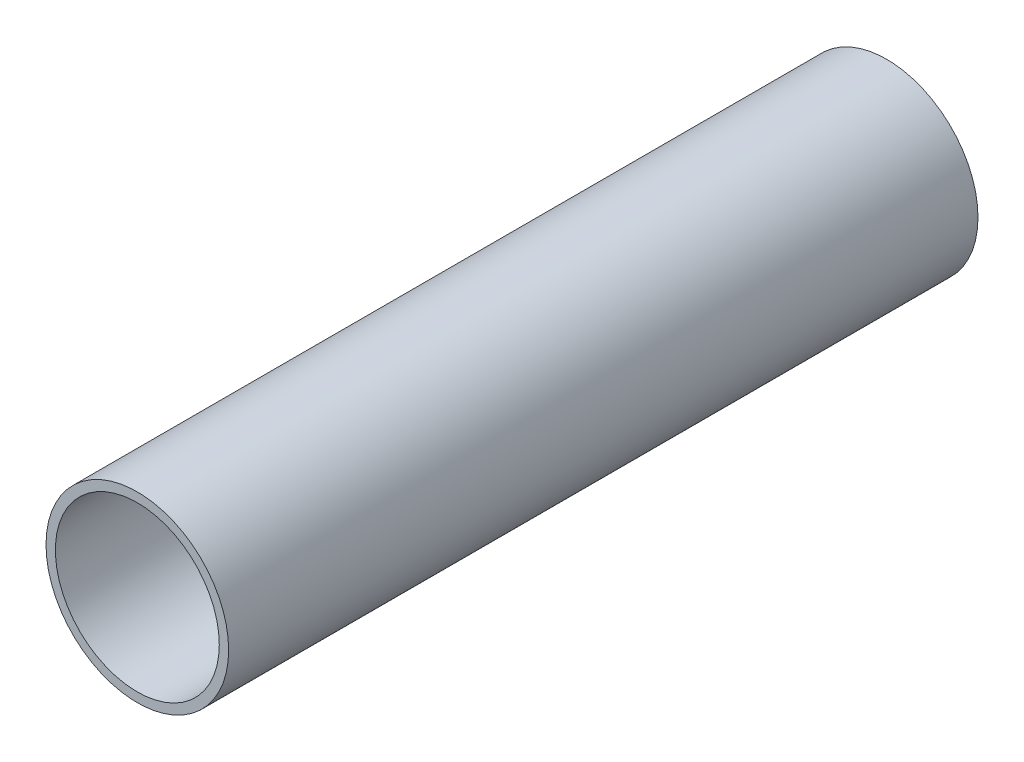
ISO-10303-21;
HEADER;
FILE_DESCRIPTION(('STEP AP214'),'2;1');
FILE_NAME('part.step','',(''),(''),'','','');
FILE_SCHEMA(('AUTOMOTIVE_DESIGN { 1 0 10303 214 1 1 1 1 }'));
ENDSEC;
DATA;
#1=APPLICATION_CONTEXT('core data for automotive mechanical design processes');
#2=APPLICATION_PROTOCOL_DEFINITION('international standard','automotive_design',2000,#1);
#3=PRODUCT_CONTEXT('',#1,'mechanical');
#4=PRODUCT('Part','Part','',(#3));
#5=PRODUCT_RELATED_PRODUCT_CATEGORY('part','',(#4));
#6=PRODUCT_DEFINITION_FORMATION('','',#4);
#7=PRODUCT_DEFINITION_CONTEXT('part definition',#1,'design');
#8=PRODUCT_DEFINITION('design','',#6,#7);
#9=PRODUCT_DEFINITION_SHAPE('','',#8);
#10=(LENGTH_UNIT() NAMED_UNIT(*) SI_UNIT(.MILLI.,.METRE.));
#11=(NAMED_UNIT(*) PLANE_ANGLE_UNIT() SI_UNIT($,.RADIAN.));
#12=(NAMED_UNIT(*) SI_UNIT($,.STERADIAN.) SOLID_ANGLE_UNIT());
#13=UNCERTAINTY_MEASURE_WITH_UNIT(LENGTH_MEASURE(1.E-05),#10,'distance_accuracy_value','');
#14=(GEOMETRIC_REPRESENTATION_CONTEXT(3) GLOBAL_UNCERTAINTY_ASSIGNED_CONTEXT((#13)) GLOBAL_UNIT_ASSIGNED_CONTEXT((#10,
#11,#12)) REPRESENTATION_CONTEXT('',''));
#15=CARTESIAN_POINT('',(0.,0.,0.));
#16=DIRECTION('',(0.,0.,1.));
#17=DIRECTION('',(1.,0.,0.));
#18=AXIS2_PLACEMENT_3D('',#15,#16,#17);
#19=CARTESIAN_POINT('',(0.,0.,16.));
#20=DIRECTION('',(0.,0.,1.));
#21=DIRECTION('',(1.,0.,0.));
#22=AXIS2_PLACEMENT_3D('',#19,#20,#21);
#23=PLANE('',#22);
#24=CARTESIAN_POINT('',(0.,0.,16.));
#25=DIRECTION('',(0.,0.,1.));
#26=DIRECTION('',(1.,0.,0.));
#27=AXIS2_PLACEMENT_3D('',#24,#25,#26);
#28=CIRCLE('',#27,1.95);
#29=CARTESIAN_POINT('',(1.95,0.,16.));
#30=VERTEX_POINT('',#29);
#31=EDGE_CURVE('E10',#30,#30,#28,.T.);
#32=ORIENTED_EDGE('',*,*,#31,.T.);
#33=EDGE_LOOP('',(#32));
#34=FACE_BOUND('',#33,.T.);
#35=CARTESIAN_POINT('',(0.,0.,16.));
#36=DIRECTION('',(0.,0.,1.));
#37=DIRECTION('',(1.,0.,0.));
#38=AXIS2_PLACEMENT_3D('',#35,#36,#37);
#39=CIRCLE('',#38,1.75);
#40=CARTESIAN_POINT('',(1.75,0.,16.));
#41=VERTEX_POINT('',#40);
#42=EDGE_CURVE('E46',#41,#41,#39,.T.);
#43=ORIENTED_EDGE('',*,*,#42,.F.);
#44=EDGE_LOOP('',(#43));
#45=FACE_BOUND('',#44,.T.);
#46=ADVANCED_FACE('F35',(#34,#45),#23,.T.);
#47=CARTESIAN_POINT('',(0.,0.,0.));
#48=DIRECTION('',(0.,0.,1.));
#49=DIRECTION('',(1.,0.,0.));
#50=AXIS2_PLACEMENT_3D('',#47,#48,#49);
#51=PLANE('',#50);
#52=CARTESIAN_POINT('',(0.,0.,0.));
#53=DIRECTION('',(0.,0.,1.));
#54=DIRECTION('',(1.,0.,0.));
#55=AXIS2_PLACEMENT_3D('',#52,#53,#54);
#56=CIRCLE('',#55,1.95);
#57=CARTESIAN_POINT('',(1.95,0.,0.));
#58=VERTEX_POINT('',#57);
#59=EDGE_CURVE('E39',#58,#58,#56,.T.);
#60=ORIENTED_EDGE('',*,*,#59,.F.);
#61=EDGE_LOOP('',(#60));
#62=FACE_BOUND('',#61,.T.);
#63=CARTESIAN_POINT('',(0.,0.,0.));
#64=DIRECTION('',(0.,0.,1.));
#65=DIRECTION('',(1.,0.,0.));
#66=AXIS2_PLACEMENT_3D('',#63,#64,#65);
#67=CIRCLE('',#66,1.75);
#68=CARTESIAN_POINT('',(1.75,0.,0.));
#69=VERTEX_POINT('',#68);
#70=EDGE_CURVE('E48',#69,#69,#67,.T.);
#71=ORIENTED_EDGE('',*,*,#70,.T.);
#72=EDGE_LOOP('',(#71));
#73=FACE_BOUND('',#72,.T.);
#74=ADVANCED_FACE('F58',(#62,#73),#51,.F.);
#75=CARTESIAN_POINT('',(0.,0.,16.));
#76=DIRECTION('',(0.,0.,-1.));
#77=DIRECTION('',(-1.,0.,0.));
#78=AXIS2_PLACEMENT_3D('',#75,#76,#77);
#79=CYLINDRICAL_SURFACE('',#78,1.95);
#80=ORIENTED_EDGE('',*,*,#31,.F.);
#81=EDGE_LOOP('',(#80));
#82=FACE_BOUND('',#81,.T.);
#83=ORIENTED_EDGE('',*,*,#59,.T.);
#84=EDGE_LOOP('',(#83));
#85=FACE_BOUND('',#84,.T.);
#86=ADVANCED_FACE('F37',(#82,#85),#79,.T.);
#87=CARTESIAN_POINT('',(0.,0.,16.));
#88=DIRECTION('',(0.,0.,-1.));
#89=DIRECTION('',(-1.,0.,0.));
#90=AXIS2_PLACEMENT_3D('',#87,#88,#89);
#91=CYLINDRICAL_SURFACE('',#90,1.75);
#92=ORIENTED_EDGE('',*,*,#42,.T.);
#93=EDGE_LOOP('',(#92));
#94=FACE_BOUND('',#93,.T.);
#95=ORIENTED_EDGE('',*,*,#70,.F.);
#96=EDGE_LOOP('',(#95));
#97=FACE_BOUND('',#96,.T.);
#98=ADVANCED_FACE('F54',(#94,#97),#91,.F.);
#99=CLOSED_SHELL('',(#46,#74,#86,#98));
#100=MANIFOLD_SOLID_BREP('B2',#99);
#101=ADVANCED_BREP_SHAPE_REPRESENTATION('',(#18,#100),#14);
#102=SHAPE_DEFINITION_REPRESENTATION(#9,#101);
ENDSEC;
END-ISO-10303-21;
